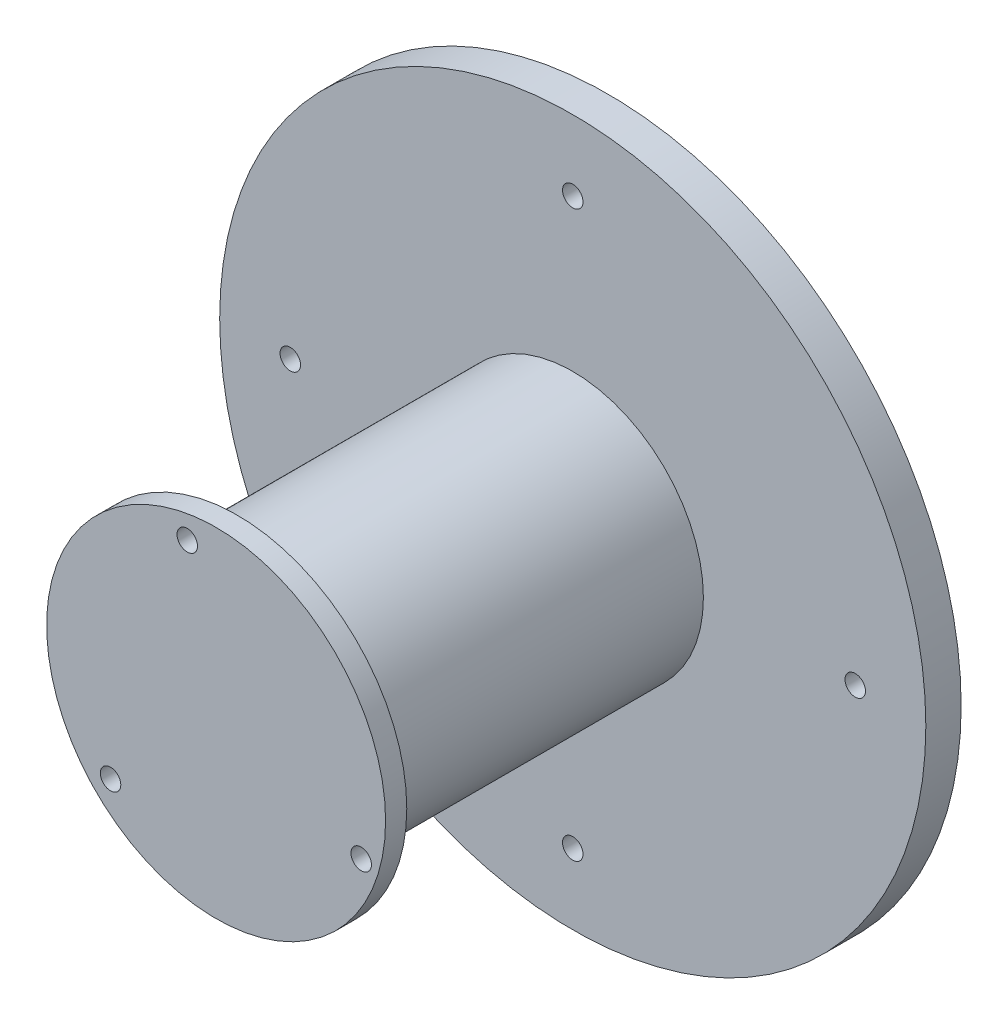
ISO-10303-21;
HEADER;
FILE_DESCRIPTION(('STEP AP214'),'2;1');
FILE_NAME('part.step','',(''),(''),'','','');
FILE_SCHEMA(('AUTOMOTIVE_DESIGN { 1 0 10303 214 1 1 1 1 }'));
ENDSEC;
DATA;
#1=APPLICATION_CONTEXT('core data for automotive mechanical design processes');
#2=APPLICATION_PROTOCOL_DEFINITION('international standard','automotive_design',2000,#1);
#3=PRODUCT_CONTEXT('',#1,'mechanical');
#4=PRODUCT('Part','Part','',(#3));
#5=PRODUCT_RELATED_PRODUCT_CATEGORY('part','',(#4));
#6=PRODUCT_DEFINITION_FORMATION('','',#4);
#7=PRODUCT_DEFINITION_CONTEXT('part definition',#1,'design');
#8=PRODUCT_DEFINITION('design','',#6,#7);
#9=PRODUCT_DEFINITION_SHAPE('','',#8);
#10=(LENGTH_UNIT() NAMED_UNIT(*) SI_UNIT(.MILLI.,.METRE.));
#11=(NAMED_UNIT(*) PLANE_ANGLE_UNIT() SI_UNIT($,.RADIAN.));
#12=(NAMED_UNIT(*) SI_UNIT($,.STERADIAN.) SOLID_ANGLE_UNIT());
#13=UNCERTAINTY_MEASURE_WITH_UNIT(LENGTH_MEASURE(1.E-05),#10,'distance_accuracy_value','');
#14=(GEOMETRIC_REPRESENTATION_CONTEXT(3) GLOBAL_UNCERTAINTY_ASSIGNED_CONTEXT((#13)) GLOBAL_UNIT_ASSIGNED_CONTEXT((#10,
#11,#12)) REPRESENTATION_CONTEXT('',''));
#15=CARTESIAN_POINT('',(0.,0.,0.));
#16=DIRECTION('',(0.,0.,1.));
#17=DIRECTION('',(1.,0.,0.));
#18=AXIS2_PLACEMENT_3D('',#15,#16,#17);
#19=CARTESIAN_POINT('',(0.,0.,50.));
#20=DIRECTION('',(0.,0.,-1.));
#21=DIRECTION('',(-1.,0.,0.));
#22=AXIS2_PLACEMENT_3D('',#19,#20,#21);
#23=CYLINDRICAL_SURFACE('',#22,18.5);
#24=CARTESIAN_POINT('',(0.,0.,0.));
#25=DIRECTION('',(0.,0.,1.));
#26=DIRECTION('',(1.,0.,0.));
#27=AXIS2_PLACEMENT_3D('',#24,#25,#26);
#28=CIRCLE('',#27,18.5);
#29=CARTESIAN_POINT('',(18.5,0.,0.));
#30=VERTEX_POINT('',#29);
#31=EDGE_CURVE('E62',#30,#30,#28,.T.);
#32=ORIENTED_EDGE('',*,*,#31,.T.);
#33=EDGE_LOOP('',(#32));
#34=FACE_BOUND('',#33,.T.);
#35=CARTESIAN_POINT('',(0.,0.,47.));
#36=DIRECTION('',(0.,0.,1.));
#37=DIRECTION('',(1.,0.,0.));
#38=AXIS2_PLACEMENT_3D('',#35,#36,#37);
#39=CIRCLE('',#38,18.5);
#40=CARTESIAN_POINT('',(18.5,0.,47.));
#41=VERTEX_POINT('',#40);
#42=EDGE_CURVE('E10',#41,#41,#39,.T.);
#43=ORIENTED_EDGE('',*,*,#42,.F.);
#44=EDGE_LOOP('',(#43));
#45=FACE_BOUND('',#44,.T.);
#46=ADVANCED_FACE('F50',(#34,#45),#23,.T.);
#47=CARTESIAN_POINT('',(0.,0.,-5.));
#48=DIRECTION('',(0.,0.,-1.));
#49=DIRECTION('',(-1.,0.,0.));
#50=AXIS2_PLACEMENT_3D('',#47,#48,#49);
#51=PLANE('',#50);
#52=CARTESIAN_POINT('',(-40.,0.,-5.));
#53=DIRECTION('',(0.,0.,-1.));
#54=DIRECTION('',(-1.,0.,0.));
#55=AXIS2_PLACEMENT_3D('',#52,#53,#54);
#56=CIRCLE('',#55,1.45);
#57=CARTESIAN_POINT('',(-41.45,0.,-5.));
#58=VERTEX_POINT('',#57);
#59=EDGE_CURVE('E116',#58,#58,#56,.F.);
#60=ORIENTED_EDGE('',*,*,#59,.T.);
#61=EDGE_LOOP('',(#60));
#62=FACE_BOUND('',#61,.T.);
#63=CARTESIAN_POINT('',(0.,-40.,-5.));
#64=DIRECTION('',(0.,0.,-1.));
#65=DIRECTION('',(-1.,0.,0.));
#66=AXIS2_PLACEMENT_3D('',#63,#64,#65);
#67=CIRCLE('',#66,1.45);
#68=CARTESIAN_POINT('',(-1.45,-40.,-5.));
#69=VERTEX_POINT('',#68);
#70=EDGE_CURVE('E104',#69,#69,#67,.F.);
#71=ORIENTED_EDGE('',*,*,#70,.T.);
#72=EDGE_LOOP('',(#71));
#73=FACE_BOUND('',#72,.T.);
#74=CARTESIAN_POINT('',(0.,0.,-5.));
#75=DIRECTION('',(0.,0.,-1.));
#76=DIRECTION('',(-1.,0.,0.));
#77=AXIS2_PLACEMENT_3D('',#74,#75,#76);
#78=CIRCLE('',#77,25.);
#79=CARTESIAN_POINT('',(-25.,0.,-5.));
#80=VERTEX_POINT('',#79);
#81=EDGE_CURVE('E54',#80,#80,#78,.T.);
#82=ORIENTED_EDGE('',*,*,#81,.F.);
#83=EDGE_LOOP('',(#82));
#84=FACE_BOUND('',#83,.T.);
#85=CARTESIAN_POINT('',(0.,0.,-5.));
#86=DIRECTION('',(0.,0.,-1.));
#87=DIRECTION('',(-1.,0.,0.));
#88=AXIS2_PLACEMENT_3D('',#85,#86,#87);
#89=CIRCLE('',#88,50.);
#90=CARTESIAN_POINT('',(-50.,0.,-5.));
#91=VERTEX_POINT('',#90);
#92=EDGE_CURVE('E133',#91,#91,#89,.T.);
#93=ORIENTED_EDGE('',*,*,#92,.T.);
#94=EDGE_LOOP('',(#93));
#95=FACE_BOUND('',#94,.T.);
#96=CARTESIAN_POINT('',(0.,40.,-5.));
#97=DIRECTION('',(0.,0.,-1.));
#98=DIRECTION('',(-1.,0.,0.));
#99=AXIS2_PLACEMENT_3D('',#96,#97,#98);
#100=CIRCLE('',#99,1.45);
#101=CARTESIAN_POINT('',(-1.45,40.,-5.));
#102=VERTEX_POINT('',#101);
#103=EDGE_CURVE('E115',#102,#102,#100,.T.);
#104=ORIENTED_EDGE('',*,*,#103,.F.);
#105=EDGE_LOOP('',(#104));
#106=FACE_BOUND('',#105,.T.);
#107=CARTESIAN_POINT('',(40.,0.,-5.));
#108=DIRECTION('',(0.,0.,-1.));
#109=DIRECTION('',(-1.,0.,0.));
#110=AXIS2_PLACEMENT_3D('',#107,#108,#109);
#111=CIRCLE('',#110,1.45);
#112=CARTESIAN_POINT('',(38.55,0.,-5.));
#113=VERTEX_POINT('',#112);
#114=EDGE_CURVE('E110',#113,#113,#111,.T.);
#115=ORIENTED_EDGE('',*,*,#114,.F.);
#116=EDGE_LOOP('',(#115));
#117=FACE_BOUND('',#116,.T.);
#118=ADVANCED_FACE('F180',(#62,#73,#84,#95,#106,#117),#51,.T.);
#119=CARTESIAN_POINT('',(0.,0.,0.));
#120=DIRECTION('',(0.,0.,-1.));
#121=DIRECTION('',(-1.,0.,0.));
#122=AXIS2_PLACEMENT_3D('',#119,#120,#121);
#123=PLANE('',#122);
#124=CARTESIAN_POINT('',(0.,40.,0.));
#125=DIRECTION('',(0.,0.,-1.));
#126=DIRECTION('',(-1.,0.,0.));
#127=AXIS2_PLACEMENT_3D('',#124,#125,#126);
#128=CIRCLE('',#127,1.45);
#129=CARTESIAN_POINT('',(-1.45,40.,0.));
#130=VERTEX_POINT('',#129);
#131=EDGE_CURVE('E148',#130,#130,#128,.T.);
#132=ORIENTED_EDGE('',*,*,#131,.T.);
#133=EDGE_LOOP('',(#132));
#134=FACE_BOUND('',#133,.T.);
#135=CARTESIAN_POINT('',(-40.,0.,0.));
#136=DIRECTION('',(0.,0.,-1.));
#137=DIRECTION('',(-1.,0.,0.));
#138=AXIS2_PLACEMENT_3D('',#135,#136,#137);
#139=CIRCLE('',#138,1.45);
#140=CARTESIAN_POINT('',(-41.45,0.,0.));
#141=VERTEX_POINT('',#140);
#142=EDGE_CURVE('E146',#141,#141,#139,.F.);
#143=ORIENTED_EDGE('',*,*,#142,.F.);
#144=EDGE_LOOP('',(#143));
#145=FACE_BOUND('',#144,.T.);
#146=CARTESIAN_POINT('',(0.,-40.,0.));
#147=DIRECTION('',(0.,0.,-1.));
#148=DIRECTION('',(-1.,0.,0.));
#149=AXIS2_PLACEMENT_3D('',#146,#147,#148);
#150=CIRCLE('',#149,1.45);
#151=CARTESIAN_POINT('',(-1.45,-40.,0.));
#152=VERTEX_POINT('',#151);
#153=EDGE_CURVE('E111',#152,#152,#150,.F.);
#154=ORIENTED_EDGE('',*,*,#153,.F.);
#155=EDGE_LOOP('',(#154));
#156=FACE_BOUND('',#155,.T.);
#157=ORIENTED_EDGE('',*,*,#31,.F.);
#158=EDGE_LOOP('',(#157));
#159=FACE_BOUND('',#158,.T.);
#160=CARTESIAN_POINT('',(0.,0.,0.));
#161=DIRECTION('',(0.,0.,-1.));
#162=DIRECTION('',(-1.,0.,0.));
#163=AXIS2_PLACEMENT_3D('',#160,#161,#162);
#164=CIRCLE('',#163,50.);
#165=CARTESIAN_POINT('',(-50.,0.,0.));
#166=VERTEX_POINT('',#165);
#167=EDGE_CURVE('E134',#166,#166,#164,.T.);
#168=ORIENTED_EDGE('',*,*,#167,.F.);
#169=EDGE_LOOP('',(#168));
#170=FACE_BOUND('',#169,.T.);
#171=CARTESIAN_POINT('',(40.,0.,0.));
#172=DIRECTION('',(0.,0.,-1.));
#173=DIRECTION('',(-1.,0.,0.));
#174=AXIS2_PLACEMENT_3D('',#171,#172,#173);
#175=CIRCLE('',#174,1.45);
#176=CARTESIAN_POINT('',(38.55,0.,0.));
#177=VERTEX_POINT('',#176);
#178=EDGE_CURVE('E70',#177,#177,#175,.T.);
#179=ORIENTED_EDGE('',*,*,#178,.T.);
#180=EDGE_LOOP('',(#179));
#181=FACE_BOUND('',#180,.T.);
#182=ADVANCED_FACE('F158',(#134,#145,#156,#159,#170,#181),#123,.F.);
#183=CARTESIAN_POINT('',(0.,0.,-5.));
#184=DIRECTION('',(0.,0.,1.));
#185=DIRECTION('',(1.,0.,0.));
#186=AXIS2_PLACEMENT_3D('',#183,#184,#185);
#187=CYLINDRICAL_SURFACE('',#186,50.);
#188=ORIENTED_EDGE('',*,*,#92,.F.);
#189=EDGE_LOOP('',(#188));
#190=FACE_BOUND('',#189,.T.);
#191=ORIENTED_EDGE('',*,*,#167,.T.);
#192=EDGE_LOOP('',(#191));
#193=FACE_BOUND('',#192,.T.);
#194=ADVANCED_FACE('F186',(#190,#193),#187,.T.);
#195=CARTESIAN_POINT('',(0.,0.,-8.));
#196=DIRECTION('',(0.,0.,-1.));
#197=DIRECTION('',(-1.,0.,0.));
#198=AXIS2_PLACEMENT_3D('',#195,#196,#197);
#199=PLANE('',#198);
#200=CARTESIAN_POINT('',(0.,0.,-8.));
#201=DIRECTION('',(0.,0.,-1.));
#202=DIRECTION('',(-1.,0.,0.));
#203=AXIS2_PLACEMENT_3D('',#200,#201,#202);
#204=CIRCLE('',#203,25.);
#205=CARTESIAN_POINT('',(-25.,0.,-8.));
#206=VERTEX_POINT('',#205);
#207=EDGE_CURVE('E130',#206,#206,#204,.T.);
#208=ORIENTED_EDGE('',*,*,#207,.T.);
#209=EDGE_LOOP('',(#208));
#210=FACE_BOUND('',#209,.T.);
#211=CARTESIAN_POINT('',(0.,0.,-8.));
#212=DIRECTION('',(0.,0.,-1.));
#213=DIRECTION('',(-1.,0.,0.));
#214=AXIS2_PLACEMENT_3D('',#211,#212,#213);
#215=CIRCLE('',#214,23.);
#216=CARTESIAN_POINT('',(-23.,0.,-8.));
#217=VERTEX_POINT('',#216);
#218=EDGE_CURVE('E124',#217,#217,#215,.T.);
#219=ORIENTED_EDGE('',*,*,#218,.F.);
#220=EDGE_LOOP('',(#219));
#221=FACE_BOUND('',#220,.T.);
#222=ADVANCED_FACE('F193',(#210,#221),#199,.T.);
#223=CARTESIAN_POINT('',(0.,0.,-8.));
#224=DIRECTION('',(0.,0.,1.));
#225=DIRECTION('',(1.,0.,0.));
#226=AXIS2_PLACEMENT_3D('',#223,#224,#225);
#227=CYLINDRICAL_SURFACE('',#226,25.);
#228=ORIENTED_EDGE('',*,*,#207,.F.);
#229=EDGE_LOOP('',(#228));
#230=FACE_BOUND('',#229,.T.);
#231=ORIENTED_EDGE('',*,*,#81,.T.);
#232=EDGE_LOOP('',(#231));
#233=FACE_BOUND('',#232,.T.);
#234=ADVANCED_FACE('F196',(#230,#233),#227,.T.);
#235=CARTESIAN_POINT('',(0.,0.,-8.));
#236=DIRECTION('',(0.,0.,1.));
#237=DIRECTION('',(1.,0.,0.));
#238=AXIS2_PLACEMENT_3D('',#235,#236,#237);
#239=CYLINDRICAL_SURFACE('',#238,23.);
#240=ORIENTED_EDGE('',*,*,#218,.T.);
#241=EDGE_LOOP('',(#240));
#242=FACE_BOUND('',#241,.T.);
#243=CARTESIAN_POINT('',(0.,0.,-5.));
#244=DIRECTION('',(0.,0.,-1.));
#245=DIRECTION('',(-1.,0.,0.));
#246=AXIS2_PLACEMENT_3D('',#243,#244,#245);
#247=CIRCLE('',#246,23.);
#248=CARTESIAN_POINT('',(-23.,0.,-5.));
#249=VERTEX_POINT('',#248);
#250=EDGE_CURVE('E127',#249,#249,#247,.T.);
#251=ORIENTED_EDGE('',*,*,#250,.F.);
#252=EDGE_LOOP('',(#251));
#253=FACE_BOUND('',#252,.T.);
#254=ADVANCED_FACE('F374',(#242,#253),#239,.F.);
#255=ORIENTED_EDGE('',*,*,#250,.T.);
#256=EDGE_LOOP('',(#255));
#257=FACE_BOUND('',#256,.T.);
#258=ADVANCED_FACE('F182',(#257),#51,.T.);
#259=CARTESIAN_POINT('',(0.,-40.,18.));
#260=DIRECTION('',(0.,0.,-1.));
#261=DIRECTION('',(-1.,0.,0.));
#262=AXIS2_PLACEMENT_3D('',#259,#260,#261);
#263=CYLINDRICAL_SURFACE('',#262,1.45);
#264=ORIENTED_EDGE('',*,*,#70,.F.);
#265=EDGE_LOOP('',(#264));
#266=FACE_BOUND('',#265,.T.);
#267=ORIENTED_EDGE('',*,*,#153,.T.);
#268=EDGE_LOOP('',(#267));
#269=FACE_BOUND('',#268,.T.);
#270=ADVANCED_FACE('F343',(#266,#269),#263,.F.);
#271=CARTESIAN_POINT('',(-40.,0.,18.));
#272=DIRECTION('',(0.,0.,-1.));
#273=DIRECTION('',(-1.,0.,0.));
#274=AXIS2_PLACEMENT_3D('',#271,#272,#273);
#275=CYLINDRICAL_SURFACE('',#274,1.45);
#276=ORIENTED_EDGE('',*,*,#59,.F.);
#277=EDGE_LOOP('',(#276));
#278=FACE_BOUND('',#277,.T.);
#279=ORIENTED_EDGE('',*,*,#142,.T.);
#280=EDGE_LOOP('',(#279));
#281=FACE_BOUND('',#280,.T.);
#282=ADVANCED_FACE('F173',(#278,#281),#275,.F.);
#283=CARTESIAN_POINT('',(0.,40.,18.));
#284=DIRECTION('',(0.,0.,-1.));
#285=DIRECTION('',(-1.,0.,0.));
#286=AXIS2_PLACEMENT_3D('',#283,#284,#285);
#287=CYLINDRICAL_SURFACE('',#286,1.45);
#288=ORIENTED_EDGE('',*,*,#103,.T.);
#289=EDGE_LOOP('',(#288));
#290=FACE_BOUND('',#289,.T.);
#291=ORIENTED_EDGE('',*,*,#131,.F.);
#292=EDGE_LOOP('',(#291));
#293=FACE_BOUND('',#292,.T.);
#294=ADVANCED_FACE('F165',(#290,#293),#287,.F.);
#295=CARTESIAN_POINT('',(40.,0.,18.));
#296=DIRECTION('',(0.,0.,-1.));
#297=DIRECTION('',(-1.,0.,0.));
#298=AXIS2_PLACEMENT_3D('',#295,#296,#297);
#299=CYLINDRICAL_SURFACE('',#298,1.45);
#300=ORIENTED_EDGE('',*,*,#114,.T.);
#301=EDGE_LOOP('',(#300));
#302=FACE_BOUND('',#301,.T.);
#303=ORIENTED_EDGE('',*,*,#178,.F.);
#304=EDGE_LOOP('',(#303));
#305=FACE_BOUND('',#304,.T.);
#306=ADVANCED_FACE('F163',(#302,#305),#299,.F.);
#307=CARTESIAN_POINT('',(-0.50448889762237,0.115254902934497,47.));
#308=DIRECTION('',(0.,0.,1.));
#309=DIRECTION('',(1.,0.,0.));
#310=AXIS2_PLACEMENT_3D('',#307,#308,#309);
#311=CYLINDRICAL_SURFACE('',#310,24.);
#312=CARTESIAN_POINT('',(-0.50448889762237,0.115254902934497,47.));
#313=DIRECTION('',(0.,0.,1.));
#314=DIRECTION('',(1.,0.,0.));
#315=AXIS2_PLACEMENT_3D('',#312,#313,#314);
#316=CIRCLE('',#315,24.);
#317=CARTESIAN_POINT('',(23.4955111023776,0.115254902934497,47.));
#318=VERTEX_POINT('',#317);
#319=EDGE_CURVE('E99',#318,#318,#316,.T.);
#320=ORIENTED_EDGE('',*,*,#319,.T.);
#321=EDGE_LOOP('',(#320));
#322=FACE_BOUND('',#321,.T.);
#323=CARTESIAN_POINT('',(-0.50448889762237,0.115254902934497,50.));
#324=DIRECTION('',(0.,0.,1.));
#325=DIRECTION('',(1.,0.,0.));
#326=AXIS2_PLACEMENT_3D('',#323,#324,#325);
#327=CIRCLE('',#326,24.);
#328=CARTESIAN_POINT('',(23.4955111023776,0.115254902934497,50.));
#329=VERTEX_POINT('',#328);
#330=EDGE_CURVE('E72',#329,#329,#327,.T.);
#331=ORIENTED_EDGE('',*,*,#330,.F.);
#332=EDGE_LOOP('',(#331));
#333=FACE_BOUND('',#332,.T.);
#334=ADVANCED_FACE('F161',(#322,#333),#311,.T.);
#335=CARTESIAN_POINT('',(-0.50448889762237,0.115254902934497,47.));
#336=DIRECTION('',(0.,0.,1.));
#337=DIRECTION('',(1.,0.,0.));
#338=AXIS2_PLACEMENT_3D('',#335,#336,#337);
#339=PLANE('',#338);
#340=CARTESIAN_POINT('',(-4.58853754517349,20.492567511088,47.));
#341=DIRECTION('',(0.,0.,-1.));
#342=DIRECTION('',(-1.,0.,0.));
#343=AXIS2_PLACEMENT_3D('',#340,#341,#342);
#344=CIRCLE('',#343,1.775);
#345=CARTESIAN_POINT('',(-6.36353754517349,20.492567511088,47.));
#346=VERTEX_POINT('',#345);
#347=EDGE_CURVE('E256',#346,#346,#344,.T.);
#348=ORIENTED_EDGE('',*,*,#347,.F.);
#349=EDGE_LOOP('',(#348));
#350=FACE_BOUND('',#349,.T.);
#351=CARTESIAN_POINT('',(-15.4528152807846,-14.2200738358825,47.));
#352=DIRECTION('',(0.,0.,-1.));
#353=DIRECTION('',(-1.,0.,0.));
#354=AXIS2_PLACEMENT_3D('',#351,#352,#353);
#355=CIRCLE('',#354,1.775);
#356=CARTESIAN_POINT('',(-17.2278152807846,-14.2200738358825,47.));
#357=VERTEX_POINT('',#356);
#358=EDGE_CURVE('E90',#357,#357,#355,.T.);
#359=ORIENTED_EDGE('',*,*,#358,.F.);
#360=EDGE_LOOP('',(#359));
#361=FACE_BOUND('',#360,.T.);
#362=CARTESIAN_POINT('',(20.0413528259555,-6.27249367520614,47.));
#363=DIRECTION('',(0.,0.,-1.));
#364=DIRECTION('',(-1.,0.,0.));
#365=AXIS2_PLACEMENT_3D('',#362,#363,#364);
#366=CIRCLE('',#365,1.775);
#367=CARTESIAN_POINT('',(18.2663528259555,-6.27249367520614,47.));
#368=VERTEX_POINT('',#367);
#369=EDGE_CURVE('E80',#368,#368,#366,.T.);
#370=ORIENTED_EDGE('',*,*,#369,.F.);
#371=EDGE_LOOP('',(#370));
#372=FACE_BOUND('',#371,.T.);
#373=ORIENTED_EDGE('',*,*,#42,.T.);
#374=EDGE_LOOP('',(#373));
#375=FACE_BOUND('',#374,.T.);
#376=ORIENTED_EDGE('',*,*,#319,.F.);
#377=EDGE_LOOP('',(#376));
#378=FACE_BOUND('',#377,.T.);
#379=ADVANCED_FACE('F167',(#350,#361,#372,#375,#378),#339,.F.);
#380=CARTESIAN_POINT('',(0.,0.,50.));
#381=DIRECTION('',(0.,0.,1.));
#382=DIRECTION('',(1.,0.,0.));
#383=AXIS2_PLACEMENT_3D('',#380,#381,#382);
#384=PLANE('',#383);
#385=CARTESIAN_POINT('',(-4.58853754517349,20.492567511088,50.));
#386=DIRECTION('',(0.,0.,1.));
#387=DIRECTION('',(1.,0.,0.));
#388=AXIS2_PLACEMENT_3D('',#385,#386,#387);
#389=CIRCLE('',#388,1.44999999999999);
#390=CARTESIAN_POINT('',(-3.1385375451735,20.492567511088,50.));
#391=VERTEX_POINT('',#390);
#392=EDGE_CURVE('E49',#391,#391,#389,.T.);
#393=ORIENTED_EDGE('',*,*,#392,.F.);
#394=EDGE_LOOP('',(#393));
#395=FACE_BOUND('',#394,.T.);
#396=CARTESIAN_POINT('',(-15.4528152807846,-14.2200738358825,50.));
#397=DIRECTION('',(0.,0.,1.));
#398=DIRECTION('',(1.,0.,0.));
#399=AXIS2_PLACEMENT_3D('',#396,#397,#398);
#400=CIRCLE('',#399,1.44999999999999);
#401=CARTESIAN_POINT('',(-14.0028152807846,-14.2200738358825,50.));
#402=VERTEX_POINT('',#401);
#403=EDGE_CURVE('E73',#402,#402,#400,.T.);
#404=ORIENTED_EDGE('',*,*,#403,.F.);
#405=EDGE_LOOP('',(#404));
#406=FACE_BOUND('',#405,.T.);
#407=CARTESIAN_POINT('',(20.0413528259555,-6.27249367520614,50.));
#408=DIRECTION('',(0.,0.,1.));
#409=DIRECTION('',(1.,0.,0.));
#410=AXIS2_PLACEMENT_3D('',#407,#408,#409);
#411=CIRCLE('',#410,1.44999999999999);
#412=CARTESIAN_POINT('',(21.4913528259555,-6.27249367520614,50.));
#413=VERTEX_POINT('',#412);
#414=EDGE_CURVE('E66',#413,#413,#411,.T.);
#415=ORIENTED_EDGE('',*,*,#414,.F.);
#416=EDGE_LOOP('',(#415));
#417=FACE_BOUND('',#416,.T.);
#418=ORIENTED_EDGE('',*,*,#330,.T.);
#419=EDGE_LOOP('',(#418));
#420=FACE_BOUND('',#419,.T.);
#421=ADVANCED_FACE('F204',(#395,#406,#417,#420),#384,.T.);
#422=CARTESIAN_POINT('',(20.0413528259555,-6.27249367520614,47.));
#423=DIRECTION('',(0.,0.,-1.));
#424=DIRECTION('',(-1.,0.,0.));
#425=AXIS2_PLACEMENT_3D('',#422,#423,#424);
#426=CYLINDRICAL_SURFACE('',#425,1.44999999999999);
#427=ORIENTED_EDGE('',*,*,#414,.T.);
#428=EDGE_LOOP('',(#427));
#429=FACE_BOUND('',#428,.T.);
#430=CARTESIAN_POINT('',(20.0413528259555,-6.27249367520614,47.325));
#431=DIRECTION('',(0.,0.,-1.));
#432=DIRECTION('',(-1.,0.,0.));
#433=AXIS2_PLACEMENT_3D('',#430,#431,#432);
#434=CIRCLE('',#433,1.44999999999999);
#435=CARTESIAN_POINT('',(18.5913528259555,-6.27249367520614,47.325));
#436=VERTEX_POINT('',#435);
#437=EDGE_CURVE('E74',#436,#436,#434,.T.);
#438=ORIENTED_EDGE('',*,*,#437,.T.);
#439=EDGE_LOOP('',(#438));
#440=FACE_BOUND('',#439,.T.);
#441=ADVANCED_FACE('F205',(#429,#440),#426,.F.);
#442=CARTESIAN_POINT('',(20.0413528259555,-6.27249367520614,47.));
#443=DIRECTION('',(0.,0.,-1.));
#444=DIRECTION('',(-1.,0.,0.));
#445=AXIS2_PLACEMENT_3D('',#442,#443,#444);
#446=CONICAL_SURFACE('',#445,1.775,0.785398163397459);
#447=ORIENTED_EDGE('',*,*,#437,.F.);
#448=EDGE_LOOP('',(#447));
#449=FACE_BOUND('',#448,.T.);
#450=ORIENTED_EDGE('',*,*,#369,.T.);
#451=EDGE_LOOP('',(#450));
#452=FACE_BOUND('',#451,.T.);
#453=ADVANCED_FACE('F208',(#449,#452),#446,.F.);
#454=CARTESIAN_POINT('',(-15.4528152807846,-14.2200738358825,47.));
#455=DIRECTION('',(0.,0.,-1.));
#456=DIRECTION('',(-1.,0.,0.));
#457=AXIS2_PLACEMENT_3D('',#454,#455,#456);
#458=CYLINDRICAL_SURFACE('',#457,1.44999999999999);
#459=ORIENTED_EDGE('',*,*,#403,.T.);
#460=EDGE_LOOP('',(#459));
#461=FACE_BOUND('',#460,.T.);
#462=CARTESIAN_POINT('',(-15.4528152807846,-14.2200738358825,47.325));
#463=DIRECTION('',(0.,0.,-1.));
#464=DIRECTION('',(-1.,0.,0.));
#465=AXIS2_PLACEMENT_3D('',#462,#463,#464);
#466=CIRCLE('',#465,1.44999999999999);
#467=CARTESIAN_POINT('',(-16.9028152807846,-14.2200738358825,47.325));
#468=VERTEX_POINT('',#467);
#469=EDGE_CURVE('E76',#468,#468,#466,.T.);
#470=ORIENTED_EDGE('',*,*,#469,.T.);
#471=EDGE_LOOP('',(#470));
#472=FACE_BOUND('',#471,.T.);
#473=ADVANCED_FACE('F226',(#461,#472),#458,.F.);
#474=CARTESIAN_POINT('',(-15.4528152807846,-14.2200738358825,47.));
#475=DIRECTION('',(0.,0.,-1.));
#476=DIRECTION('',(-1.,0.,0.));
#477=AXIS2_PLACEMENT_3D('',#474,#475,#476);
#478=CONICAL_SURFACE('',#477,1.775,0.785398163397456);
#479=ORIENTED_EDGE('',*,*,#469,.F.);
#480=EDGE_LOOP('',(#479));
#481=FACE_BOUND('',#480,.T.);
#482=ORIENTED_EDGE('',*,*,#358,.T.);
#483=EDGE_LOOP('',(#482));
#484=FACE_BOUND('',#483,.T.);
#485=ADVANCED_FACE('F236',(#481,#484),#478,.F.);
#486=CARTESIAN_POINT('',(-4.58853754517349,20.492567511088,47.));
#487=DIRECTION('',(0.,0.,-1.));
#488=DIRECTION('',(-1.,0.,0.));
#489=AXIS2_PLACEMENT_3D('',#486,#487,#488);
#490=CYLINDRICAL_SURFACE('',#489,1.44999999999999);
#491=ORIENTED_EDGE('',*,*,#392,.T.);
#492=EDGE_LOOP('',(#491));
#493=FACE_BOUND('',#492,.T.);
#494=CARTESIAN_POINT('',(-4.58853754517349,20.492567511088,47.325));
#495=DIRECTION('',(0.,0.,-1.));
#496=DIRECTION('',(-1.,0.,0.));
#497=AXIS2_PLACEMENT_3D('',#494,#495,#496);
#498=CIRCLE('',#497,1.44999999999999);
#499=CARTESIAN_POINT('',(-6.03853754517348,20.492567511088,47.325));
#500=VERTEX_POINT('',#499);
#501=EDGE_CURVE('E254',#500,#500,#498,.T.);
#502=ORIENTED_EDGE('',*,*,#501,.T.);
#503=EDGE_LOOP('',(#502));
#504=FACE_BOUND('',#503,.T.);
#505=ADVANCED_FACE('F241',(#493,#504),#490,.F.);
#506=CARTESIAN_POINT('',(-4.58853754517349,20.492567511088,47.));
#507=DIRECTION('',(0.,0.,-1.));
#508=DIRECTION('',(-1.,0.,0.));
#509=AXIS2_PLACEMENT_3D('',#506,#507,#508);
#510=CONICAL_SURFACE('',#509,1.775,0.785398163397456);
#511=ORIENTED_EDGE('',*,*,#501,.F.);
#512=EDGE_LOOP('',(#511));
#513=FACE_BOUND('',#512,.T.);
#514=ORIENTED_EDGE('',*,*,#347,.T.);
#515=EDGE_LOOP('',(#514));
#516=FACE_BOUND('',#515,.T.);
#517=ADVANCED_FACE('F244',(#513,#516),#510,.F.);
#518=CLOSED_SHELL('',(#46,#118,#182,#194,#222,#234,#254,#258,#270,#282,#294,#306,#334,#379,#421,
#441,#453,#473,#485,#505,#517));
#519=MANIFOLD_SOLID_BREP('B2',#518);
#520=ADVANCED_BREP_SHAPE_REPRESENTATION('',(#18,#519),#14);
#521=SHAPE_DEFINITION_REPRESENTATION(#9,#520);
ENDSEC;
END-ISO-10303-21;
